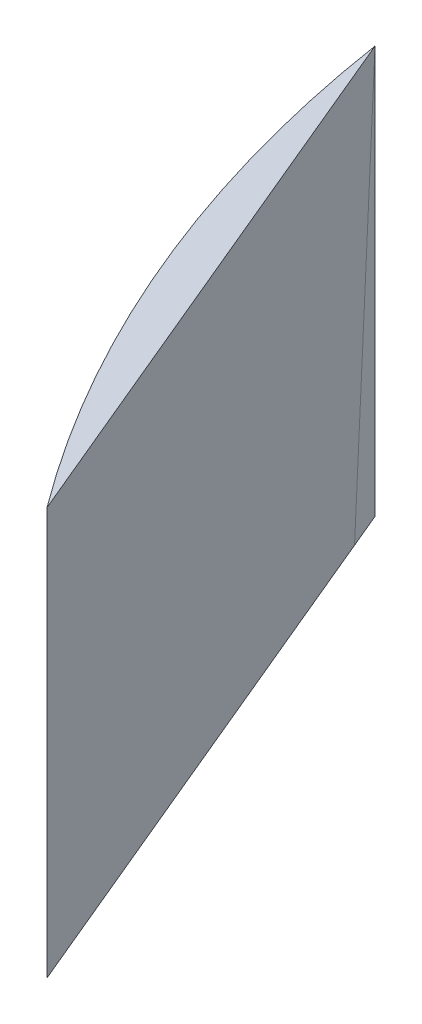
ISO-10303-21;
HEADER;
FILE_DESCRIPTION(('STEP AP214'),'2;1');
FILE_NAME('part.step','',(''),(''),'','','');
FILE_SCHEMA(('AUTOMOTIVE_DESIGN { 1 0 10303 214 1 1 1 1 }'));
ENDSEC;
DATA;
#1=APPLICATION_CONTEXT('core data for automotive mechanical design processes');
#2=APPLICATION_PROTOCOL_DEFINITION('international standard','automotive_design',2000,#1);
#3=PRODUCT_CONTEXT('',#1,'mechanical');
#4=PRODUCT('Part','Part','',(#3));
#5=PRODUCT_RELATED_PRODUCT_CATEGORY('part','',(#4));
#6=PRODUCT_DEFINITION_FORMATION('','',#4);
#7=PRODUCT_DEFINITION_CONTEXT('part definition',#1,'design');
#8=PRODUCT_DEFINITION('design','',#6,#7);
#9=PRODUCT_DEFINITION_SHAPE('','',#8);
#10=(LENGTH_UNIT() NAMED_UNIT(*) SI_UNIT(.MILLI.,.METRE.));
#11=(NAMED_UNIT(*) PLANE_ANGLE_UNIT() SI_UNIT($,.RADIAN.));
#12=(NAMED_UNIT(*) SI_UNIT($,.STERADIAN.) SOLID_ANGLE_UNIT());
#13=UNCERTAINTY_MEASURE_WITH_UNIT(LENGTH_MEASURE(1.E-05),#10,'distance_accuracy_value','');
#14=(GEOMETRIC_REPRESENTATION_CONTEXT(3) GLOBAL_UNCERTAINTY_ASSIGNED_CONTEXT((#13)) GLOBAL_UNIT_ASSIGNED_CONTEXT((#10,
#11,#12)) REPRESENTATION_CONTEXT('',''));
#15=CARTESIAN_POINT('',(0.,0.,0.));
#16=DIRECTION('',(0.,0.,1.));
#17=DIRECTION('',(1.,0.,0.));
#18=AXIS2_PLACEMENT_3D('',#15,#16,#17);
#19=CARTESIAN_POINT('',(-1.780279349225,8.5,-18.16644269139));
#20=DIRECTION('',(0.,-1.,0.));
#21=DIRECTION('',(-1.,0.,0.));
#22=AXIS2_PLACEMENT_3D('',#19,#20,#21);
#23=CYLINDRICAL_SURFACE('',#22,1.25);
#24=DIRECTION('',(0.,-1.,0.));
#25=VECTOR('',#24,1.);
#26=CARTESIAN_POINT('',(-2.784124202225,8.3,-17.42159672639));
#27=LINE('',#26,#25);
#28=CARTESIAN_POINT('',(-2.784124202377,8.5,-17.42159672676));
#29=VERTEX_POINT('',#28);
#30=CARTESIAN_POINT('',(-2.784124202372,8.1,-17.42159672678));
#31=VERTEX_POINT('',#30);
#32=EDGE_CURVE('E11',#29,#31,#27,.T.);
#33=ORIENTED_EDGE('',*,*,#32,.F.);
#34=CARTESIAN_POINT('',(-1.780279349225,8.5,-18.16644269139));
#35=DIRECTION('',(0.,-1.,0.));
#36=DIRECTION('',(-1.,0.,0.));
#37=AXIS2_PLACEMENT_3D('',#34,#35,#36);
#38=CIRCLE('',#37,1.25);
#39=CARTESIAN_POINT('',(-3.01555788402,8.5,-17.9751655579));
#40=VERTEX_POINT('',#39);
#41=EDGE_CURVE('E60',#29,#40,#38,.T.);
#42=ORIENTED_EDGE('',*,*,#41,.T.);
#43=DIRECTION('',(0.,1.,0.));
#44=VECTOR('',#43,1.);
#45=CARTESIAN_POINT('',(-3.015557884225,8.3,-17.97516555839));
#46=LINE('',#45,#44);
#47=CARTESIAN_POINT('',(-3.015557884133,8.1,-17.97516555839));
#48=VERTEX_POINT('',#47);
#49=EDGE_CURVE('E28',#48,#40,#46,.T.);
#50=ORIENTED_EDGE('',*,*,#49,.F.);
#51=CARTESIAN_POINT('',(-2.78412420238566,8.1,-17.4215967267743));
#52=DIRECTION('',(-0.385722802836871,0.,-0.922614718813692));
#53=VECTOR('',#52,1.);
#54=LINE('',#51,#53);
#55=EDGE_CURVE('E55',#31,#48,#54,.T.);
#56=ORIENTED_EDGE('',*,*,#55,.F.);
#57=EDGE_LOOP('',(#33,#42,#50,#56));
#58=FACE_BOUND('',#57,.T.);
#59=ADVANCED_FACE('F17',(#58),#23,.T.);
#60=CARTESIAN_POINT('',(-2.784124202225,8.1,-17.42159672639));
#61=DIRECTION('',(0.922614718813692,0.,-0.385722802836871));
#62=DIRECTION('',(0.,-1.,0.));
#63=AXIS2_PLACEMENT_3D('',#60,#61,#62);
#64=PLANE('',#63);
#65=ORIENTED_EDGE('',*,*,#55,.T.);
#66=ORIENTED_EDGE('',*,*,#49,.T.);
#67=DIRECTION('',(-0.385722802836871,0.,-0.922614718813692));
#68=VECTOR('',#67,1.);
#69=CARTESIAN_POINT('',(-2.784124202225,8.5,-17.42159672639));
#70=LINE('',#69,#68);
#71=EDGE_CURVE('E53',#29,#40,#70,.T.);
#72=ORIENTED_EDGE('',*,*,#71,.F.);
#73=ORIENTED_EDGE('',*,*,#32,.T.);
#74=EDGE_LOOP('',(#65,#66,#72,#73));
#75=FACE_BOUND('',#74,.T.);
#76=ADVANCED_FACE('F52',(#75),#64,.T.);
#77=CARTESIAN_POINT('',(-2.782735600225,8.5,-17.97848697139));
#78=DIRECTION('',(0.,-1.,0.));
#79=DIRECTION('',(0.,0.,-1.));
#80=AXIS2_PLACEMENT_3D('',#77,#78,#79);
#81=PLANE('',#80);
#82=ORIENTED_EDGE('',*,*,#41,.F.);
#83=ORIENTED_EDGE('',*,*,#71,.T.);
#84=EDGE_LOOP('',(#82,#83));
#85=FACE_BOUND('',#84,.T.);
#86=ADVANCED_FACE('F59',(#85),#81,.F.);
#87=CLOSED_SHELL('',(#59,#76,#86));
#88=MANIFOLD_SOLID_BREP('B1',#87);
#89=ADVANCED_BREP_SHAPE_REPRESENTATION('',(#18,#88),#14);
#90=SHAPE_DEFINITION_REPRESENTATION(#9,#89);
ENDSEC;
END-ISO-10303-21;
